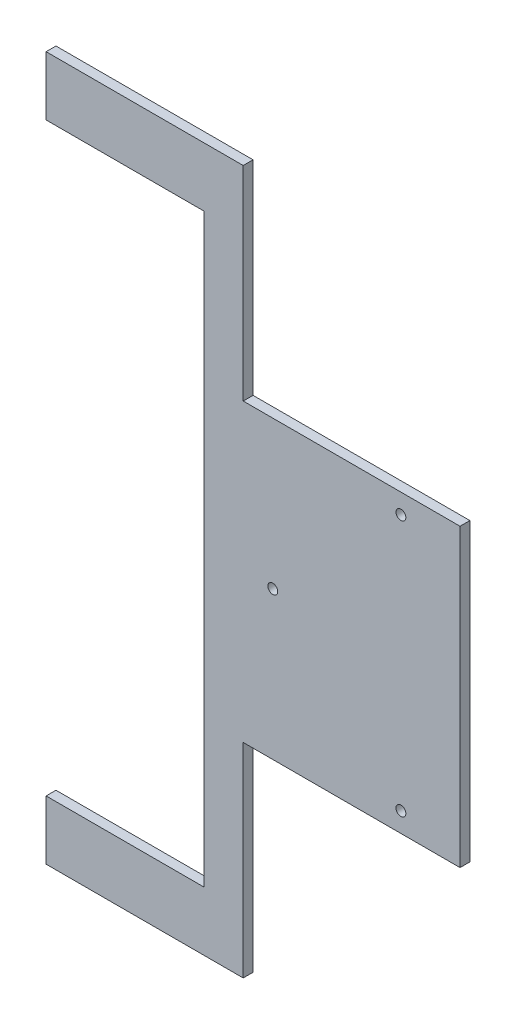
ISO-10303-21;
HEADER;
FILE_DESCRIPTION(('STEP AP214'),'2;1');
FILE_NAME('part.step','',(''),(''),'','','');
FILE_SCHEMA(('AUTOMOTIVE_DESIGN { 1 0 10303 214 1 1 1 1 }'));
ENDSEC;
DATA;
#1=APPLICATION_CONTEXT('core data for automotive mechanical design processes');
#2=APPLICATION_PROTOCOL_DEFINITION('international standard','automotive_design',2000,#1);
#3=PRODUCT_CONTEXT('',#1,'mechanical');
#4=PRODUCT('Part','Part','',(#3));
#5=PRODUCT_RELATED_PRODUCT_CATEGORY('part','',(#4));
#6=PRODUCT_DEFINITION_FORMATION('','',#4);
#7=PRODUCT_DEFINITION_CONTEXT('part definition',#1,'design');
#8=PRODUCT_DEFINITION('design','',#6,#7);
#9=PRODUCT_DEFINITION_SHAPE('','',#8);
#10=(LENGTH_UNIT() NAMED_UNIT(*) SI_UNIT(.MILLI.,.METRE.));
#11=(NAMED_UNIT(*) PLANE_ANGLE_UNIT() SI_UNIT($,.RADIAN.));
#12=(NAMED_UNIT(*) SI_UNIT($,.STERADIAN.) SOLID_ANGLE_UNIT());
#13=UNCERTAINTY_MEASURE_WITH_UNIT(LENGTH_MEASURE(1.E-05),#10,'distance_accuracy_value','');
#14=(GEOMETRIC_REPRESENTATION_CONTEXT(3) GLOBAL_UNCERTAINTY_ASSIGNED_CONTEXT((#13)) GLOBAL_UNIT_ASSIGNED_CONTEXT((#10,
#11,#12)) REPRESENTATION_CONTEXT('',''));
#15=CARTESIAN_POINT('',(0.,0.,0.));
#16=DIRECTION('',(0.,0.,1.));
#17=DIRECTION('',(1.,0.,0.));
#18=AXIS2_PLACEMENT_3D('',#15,#16,#17);
#19=CARTESIAN_POINT('',(0.,0.,5.));
#20=DIRECTION('',(0.,0.,1.));
#21=DIRECTION('',(1.,0.,0.));
#22=AXIS2_PLACEMENT_3D('',#19,#20,#21);
#23=PLANE('',#22);
#24=CARTESIAN_POINT('',(30.0006920415225,-47.4544735541276,5.));
#25=DIRECTION('',(0.,0.,1.));
#26=DIRECTION('',(1.,0.,0.));
#27=AXIS2_PLACEMENT_3D('',#24,#25,#26);
#28=CIRCLE('',#27,2.5);
#29=CARTESIAN_POINT('',(32.5006920415225,-47.4544735541276,5.));
#30=VERTEX_POINT('',#29);
#31=EDGE_CURVE('E290',#30,#30,#28,.T.);
#32=ORIENTED_EDGE('',*,*,#31,.F.);
#33=EDGE_LOOP('',(#32));
#34=FACE_BOUND('',#33,.T.);
#35=DIRECTION('',(0.,-1.,0.));
#36=VECTOR('',#35,1.);
#37=CARTESIAN_POINT('',(-149.999307958477,166.045526445872,5.));
#38=LINE('',#37,#36);
#39=CARTESIAN_POINT('',(-149.999307958477,196.045526445872,5.));
#40=VERTEX_POINT('',#39);
#41=CARTESIAN_POINT('',(-149.999307958477,166.045526445872,5.));
#42=VERTEX_POINT('',#41);
#43=EDGE_CURVE('E181',#40,#42,#38,.T.);
#44=ORIENTED_EDGE('',*,*,#43,.T.);
#45=DIRECTION('',(1.,0.,0.));
#46=VECTOR('',#45,1.);
#47=CARTESIAN_POINT('',(-69.9993079584775,166.045526445872,5.));
#48=LINE('',#47,#46);
#49=CARTESIAN_POINT('',(-69.9993079584775,166.045526445872,5.));
#50=VERTEX_POINT('',#49);
#51=EDGE_CURVE('E107',#42,#50,#48,.T.);
#52=ORIENTED_EDGE('',*,*,#51,.T.);
#53=DIRECTION('',(0.,-1.,0.));
#54=VECTOR('',#53,1.);
#55=CARTESIAN_POINT('',(-69.9993079584775,-130.954473554128,5.));
#56=LINE('',#55,#54);
#57=CARTESIAN_POINT('',(-69.9993079584775,-130.954473554128,5.));
#58=VERTEX_POINT('',#57);
#59=EDGE_CURVE('E208',#50,#58,#56,.T.);
#60=ORIENTED_EDGE('',*,*,#59,.T.);
#61=DIRECTION('',(-1.,0.,0.));
#62=VECTOR('',#61,1.);
#63=CARTESIAN_POINT('',(-69.9993079584775,-130.954473554128,5.));
#64=LINE('',#63,#62);
#65=CARTESIAN_POINT('',(-149.999307958477,-130.954473554128,5.));
#66=VERTEX_POINT('',#65);
#67=EDGE_CURVE('E227',#58,#66,#64,.T.);
#68=ORIENTED_EDGE('',*,*,#67,.T.);
#69=DIRECTION('',(0.,-1.,0.));
#70=VECTOR('',#69,1.);
#71=CARTESIAN_POINT('',(-149.999307958477,-160.954473554128,5.));
#72=LINE('',#71,#70);
#73=CARTESIAN_POINT('',(-149.999307958477,-160.954473554128,5.));
#74=VERTEX_POINT('',#73);
#75=EDGE_CURVE('E224',#66,#74,#72,.T.);
#76=ORIENTED_EDGE('',*,*,#75,.T.);
#77=DIRECTION('',(1.,0.,0.));
#78=VECTOR('',#77,1.);
#79=CARTESIAN_POINT('',(-49.9993079584775,-160.954473554128,5.));
#80=LINE('',#79,#78);
#81=CARTESIAN_POINT('',(-49.9993079584775,-160.954473554128,5.));
#82=VERTEX_POINT('',#81);
#83=EDGE_CURVE('E226',#74,#82,#80,.T.);
#84=ORIENTED_EDGE('',*,*,#83,.T.);
#85=DIRECTION('',(0.,1.,0.));
#86=VECTOR('',#85,1.);
#87=CARTESIAN_POINT('',(-49.9993079584775,-130.954473554128,5.));
#88=LINE('',#87,#86);
#89=CARTESIAN_POINT('',(-49.9993079584775,-57.4544735541275,5.));
#90=VERTEX_POINT('',#89);
#91=EDGE_CURVE('E229',#82,#90,#88,.T.);
#92=ORIENTED_EDGE('',*,*,#91,.T.);
#93=DIRECTION('',(1.,0.,0.));
#94=VECTOR('',#93,1.);
#95=CARTESIAN_POINT('',(60.0006920415225,-57.4544735541275,5.));
#96=LINE('',#95,#94);
#97=CARTESIAN_POINT('',(60.0006920415225,-57.4544735541275,5.));
#98=VERTEX_POINT('',#97);
#99=EDGE_CURVE('E235',#90,#98,#96,.T.);
#100=ORIENTED_EDGE('',*,*,#99,.T.);
#101=DIRECTION('',(0.,1.,0.));
#102=VECTOR('',#101,1.);
#103=CARTESIAN_POINT('',(60.0006920415225,92.5455264458725,5.));
#104=LINE('',#103,#102);
#105=CARTESIAN_POINT('',(60.0006920415225,92.5455264458725,5.));
#106=VERTEX_POINT('',#105);
#107=EDGE_CURVE('E138',#98,#106,#104,.T.);
#108=ORIENTED_EDGE('',*,*,#107,.T.);
#109=DIRECTION('',(-1.,0.,0.));
#110=VECTOR('',#109,1.);
#111=CARTESIAN_POINT('',(-49.9993079584775,92.5455264458725,5.));
#112=LINE('',#111,#110);
#113=CARTESIAN_POINT('',(-49.9993079584775,92.5455264458725,5.));
#114=VERTEX_POINT('',#113);
#115=EDGE_CURVE('E132',#106,#114,#112,.T.);
#116=ORIENTED_EDGE('',*,*,#115,.T.);
#117=DIRECTION('',(0.,1.,0.));
#118=VECTOR('',#117,1.);
#119=CARTESIAN_POINT('',(-49.9993079584775,166.045526445872,5.));
#120=LINE('',#119,#118);
#121=CARTESIAN_POINT('',(-49.9993079584775,196.045526445872,5.));
#122=VERTEX_POINT('',#121);
#123=EDGE_CURVE('E136',#114,#122,#120,.T.);
#124=ORIENTED_EDGE('',*,*,#123,.T.);
#125=DIRECTION('',(-1.,0.,0.));
#126=VECTOR('',#125,1.);
#127=CARTESIAN_POINT('',(-49.9993079584775,196.045526445872,5.));
#128=LINE('',#127,#126);
#129=EDGE_CURVE('E53',#122,#40,#128,.T.);
#130=ORIENTED_EDGE('',*,*,#129,.T.);
#131=EDGE_LOOP('',(#44,#52,#60,#68,#76,#84,#92,#100,#108,#116,#124,#130));
#132=FACE_BOUND('',#131,.T.);
#133=CARTESIAN_POINT('',(-34.9993079584775,17.5455264458724,5.));
#134=DIRECTION('',(0.,0.,1.));
#135=DIRECTION('',(1.,0.,0.));
#136=AXIS2_PLACEMENT_3D('',#133,#134,#135);
#137=CIRCLE('',#136,2.5);
#138=CARTESIAN_POINT('',(-32.4993079584775,17.5455264458724,5.));
#139=VERTEX_POINT('',#138);
#140=EDGE_CURVE('E161',#139,#139,#137,.T.);
#141=ORIENTED_EDGE('',*,*,#140,.F.);
#142=EDGE_LOOP('',(#141));
#143=FACE_BOUND('',#142,.T.);
#144=CARTESIAN_POINT('',(30.0006920415225,82.5455264458725,5.));
#145=DIRECTION('',(0.,0.,1.));
#146=DIRECTION('',(1.,0.,0.));
#147=AXIS2_PLACEMENT_3D('',#144,#145,#146);
#148=CIRCLE('',#147,2.5);
#149=CARTESIAN_POINT('',(32.5006920415225,82.5455264458725,5.));
#150=VERTEX_POINT('',#149);
#151=EDGE_CURVE('E281',#150,#150,#148,.T.);
#152=ORIENTED_EDGE('',*,*,#151,.F.);
#153=EDGE_LOOP('',(#152));
#154=FACE_BOUND('',#153,.T.);
#155=ADVANCED_FACE('F36',(#34,#132,#143,#154),#23,.T.);
#156=CARTESIAN_POINT('',(0.,0.,0.));
#157=DIRECTION('',(0.,0.,1.));
#158=DIRECTION('',(1.,0.,0.));
#159=AXIS2_PLACEMENT_3D('',#156,#157,#158);
#160=PLANE('',#159);
#161=DIRECTION('',(0.,-1.,0.));
#162=VECTOR('',#161,1.);
#163=CARTESIAN_POINT('',(-149.999307958477,166.045526445872,0.));
#164=LINE('',#163,#162);
#165=CARTESIAN_POINT('',(-149.999307958477,196.045526445872,0.));
#166=VERTEX_POINT('',#165);
#167=CARTESIAN_POINT('',(-149.999307958477,166.045526445872,0.));
#168=VERTEX_POINT('',#167);
#169=EDGE_CURVE('E157',#166,#168,#164,.T.);
#170=ORIENTED_EDGE('',*,*,#169,.F.);
#171=DIRECTION('',(-1.,0.,0.));
#172=VECTOR('',#171,1.);
#173=CARTESIAN_POINT('',(-49.9993079584775,196.045526445872,0.));
#174=LINE('',#173,#172);
#175=CARTESIAN_POINT('',(-49.9993079584775,196.045526445872,0.));
#176=VERTEX_POINT('',#175);
#177=EDGE_CURVE('E99',#176,#166,#174,.T.);
#178=ORIENTED_EDGE('',*,*,#177,.F.);
#179=DIRECTION('',(0.,1.,0.));
#180=VECTOR('',#179,1.);
#181=CARTESIAN_POINT('',(-49.9993079584775,166.045526445872,0.));
#182=LINE('',#181,#180);
#183=CARTESIAN_POINT('',(-49.9993079584775,92.5455264458725,0.));
#184=VERTEX_POINT('',#183);
#185=EDGE_CURVE('E93',#184,#176,#182,.T.);
#186=ORIENTED_EDGE('',*,*,#185,.F.);
#187=DIRECTION('',(-1.,0.,0.));
#188=VECTOR('',#187,1.);
#189=CARTESIAN_POINT('',(-49.9993079584775,92.5455264458725,0.));
#190=LINE('',#189,#188);
#191=CARTESIAN_POINT('',(60.0006920415225,92.5455264458725,0.));
#192=VERTEX_POINT('',#191);
#193=EDGE_CURVE('E147',#192,#184,#190,.T.);
#194=ORIENTED_EDGE('',*,*,#193,.F.);
#195=DIRECTION('',(0.,1.,0.));
#196=VECTOR('',#195,1.);
#197=CARTESIAN_POINT('',(60.0006920415225,92.5455264458725,0.));
#198=LINE('',#197,#196);
#199=CARTESIAN_POINT('',(60.0006920415225,-57.4544735541275,0.));
#200=VERTEX_POINT('',#199);
#201=EDGE_CURVE('E176',#200,#192,#198,.T.);
#202=ORIENTED_EDGE('',*,*,#201,.F.);
#203=DIRECTION('',(1.,0.,0.));
#204=VECTOR('',#203,1.);
#205=CARTESIAN_POINT('',(60.0006920415225,-57.4544735541275,0.));
#206=LINE('',#205,#204);
#207=CARTESIAN_POINT('',(-49.9993079584775,-57.4544735541275,0.));
#208=VERTEX_POINT('',#207);
#209=EDGE_CURVE('E174',#208,#200,#206,.T.);
#210=ORIENTED_EDGE('',*,*,#209,.F.);
#211=DIRECTION('',(0.,1.,0.));
#212=VECTOR('',#211,1.);
#213=CARTESIAN_POINT('',(-49.9993079584775,-130.954473554128,0.));
#214=LINE('',#213,#212);
#215=CARTESIAN_POINT('',(-49.9993079584775,-160.954473554128,0.));
#216=VERTEX_POINT('',#215);
#217=EDGE_CURVE('E172',#216,#208,#214,.T.);
#218=ORIENTED_EDGE('',*,*,#217,.F.);
#219=DIRECTION('',(1.,0.,0.));
#220=VECTOR('',#219,1.);
#221=CARTESIAN_POINT('',(-49.9993079584775,-160.954473554128,0.));
#222=LINE('',#221,#220);
#223=CARTESIAN_POINT('',(-149.999307958477,-160.954473554128,0.));
#224=VERTEX_POINT('',#223);
#225=EDGE_CURVE('E169',#224,#216,#222,.T.);
#226=ORIENTED_EDGE('',*,*,#225,.F.);
#227=DIRECTION('',(0.,-1.,0.));
#228=VECTOR('',#227,1.);
#229=CARTESIAN_POINT('',(-149.999307958477,-160.954473554128,0.));
#230=LINE('',#229,#228);
#231=CARTESIAN_POINT('',(-149.999307958477,-130.954473554128,0.));
#232=VERTEX_POINT('',#231);
#233=EDGE_CURVE('E167',#232,#224,#230,.T.);
#234=ORIENTED_EDGE('',*,*,#233,.F.);
#235=DIRECTION('',(-1.,0.,0.));
#236=VECTOR('',#235,1.);
#237=CARTESIAN_POINT('',(-69.9993079584775,-130.954473554128,0.));
#238=LINE('',#237,#236);
#239=CARTESIAN_POINT('',(-69.9993079584775,-130.954473554128,0.));
#240=VERTEX_POINT('',#239);
#241=EDGE_CURVE('E165',#240,#232,#238,.T.);
#242=ORIENTED_EDGE('',*,*,#241,.F.);
#243=DIRECTION('',(0.,-1.,0.));
#244=VECTOR('',#243,1.);
#245=CARTESIAN_POINT('',(-69.9993079584775,-130.954473554128,0.));
#246=LINE('',#245,#244);
#247=CARTESIAN_POINT('',(-69.9993079584775,166.045526445872,0.));
#248=VERTEX_POINT('',#247);
#249=EDGE_CURVE('E163',#248,#240,#246,.T.);
#250=ORIENTED_EDGE('',*,*,#249,.F.);
#251=DIRECTION('',(1.,0.,0.));
#252=VECTOR('',#251,1.);
#253=CARTESIAN_POINT('',(-69.9993079584775,166.045526445872,0.));
#254=LINE('',#253,#252);
#255=EDGE_CURVE('E160',#168,#248,#254,.T.);
#256=ORIENTED_EDGE('',*,*,#255,.F.);
#257=EDGE_LOOP('',(#170,#178,#186,#194,#202,#210,#218,#226,#234,#242,#250,#256));
#258=FACE_BOUND('',#257,.T.);
#259=CARTESIAN_POINT('',(-34.9993079584775,17.5455264458724,0.));
#260=DIRECTION('',(0.,0.,1.));
#261=DIRECTION('',(1.,0.,0.));
#262=AXIS2_PLACEMENT_3D('',#259,#260,#261);
#263=CIRCLE('',#262,2.5);
#264=CARTESIAN_POINT('',(-32.4993079584775,17.5455264458724,0.));
#265=VERTEX_POINT('',#264);
#266=EDGE_CURVE('E293',#265,#265,#263,.T.);
#267=ORIENTED_EDGE('',*,*,#266,.T.);
#268=EDGE_LOOP('',(#267));
#269=FACE_BOUND('',#268,.T.);
#270=CARTESIAN_POINT('',(30.0006920415225,-47.4544735541276,0.));
#271=DIRECTION('',(0.,0.,1.));
#272=DIRECTION('',(1.,0.,0.));
#273=AXIS2_PLACEMENT_3D('',#270,#271,#272);
#274=CIRCLE('',#273,2.5);
#275=CARTESIAN_POINT('',(32.5006920415225,-47.4544735541276,0.));
#276=VERTEX_POINT('',#275);
#277=EDGE_CURVE('E287',#276,#276,#274,.T.);
#278=ORIENTED_EDGE('',*,*,#277,.T.);
#279=EDGE_LOOP('',(#278));
#280=FACE_BOUND('',#279,.T.);
#281=CARTESIAN_POINT('',(30.0006920415225,82.5455264458725,0.));
#282=DIRECTION('',(0.,0.,1.));
#283=DIRECTION('',(1.,0.,0.));
#284=AXIS2_PLACEMENT_3D('',#281,#282,#283);
#285=CIRCLE('',#284,2.5);
#286=CARTESIAN_POINT('',(32.5006920415225,82.5455264458725,0.));
#287=VERTEX_POINT('',#286);
#288=EDGE_CURVE('E284',#287,#287,#285,.T.);
#289=ORIENTED_EDGE('',*,*,#288,.T.);
#290=EDGE_LOOP('',(#289));
#291=FACE_BOUND('',#290,.T.);
#292=ADVANCED_FACE('F212',(#258,#269,#280,#291),#160,.F.);
#293=CARTESIAN_POINT('',(-149.999307958477,166.045526445872,5.));
#294=DIRECTION('',(1.,0.,0.));
#295=DIRECTION('',(0.,0.,-1.));
#296=AXIS2_PLACEMENT_3D('',#293,#294,#295);
#297=PLANE('',#296);
#298=ORIENTED_EDGE('',*,*,#169,.T.);
#299=DIRECTION('',(0.,0.,-1.));
#300=VECTOR('',#299,1.);
#301=CARTESIAN_POINT('',(-149.999307958477,166.045526445872,5.));
#302=LINE('',#301,#300);
#303=EDGE_CURVE('E11',#42,#168,#302,.T.);
#304=ORIENTED_EDGE('',*,*,#303,.F.);
#305=ORIENTED_EDGE('',*,*,#43,.F.);
#306=DIRECTION('',(0.,0.,-1.));
#307=VECTOR('',#306,1.);
#308=CARTESIAN_POINT('',(-149.999307958477,196.045526445872,5.));
#309=LINE('',#308,#307);
#310=EDGE_CURVE('E153',#40,#166,#309,.T.);
#311=ORIENTED_EDGE('',*,*,#310,.T.);
#312=EDGE_LOOP('',(#298,#304,#305,#311));
#313=FACE_BOUND('',#312,.T.);
#314=ADVANCED_FACE('F38',(#313),#297,.F.);
#315=CARTESIAN_POINT('',(-69.9993079584775,166.045526445872,5.));
#316=DIRECTION('',(0.,1.,0.));
#317=DIRECTION('',(0.,0.,1.));
#318=AXIS2_PLACEMENT_3D('',#315,#316,#317);
#319=PLANE('',#318);
#320=ORIENTED_EDGE('',*,*,#255,.T.);
#321=DIRECTION('',(0.,0.,-1.));
#322=VECTOR('',#321,1.);
#323=CARTESIAN_POINT('',(-69.9993079584775,166.045526445872,5.));
#324=LINE('',#323,#322);
#325=EDGE_CURVE('E45',#50,#248,#324,.T.);
#326=ORIENTED_EDGE('',*,*,#325,.F.);
#327=ORIENTED_EDGE('',*,*,#51,.F.);
#328=ORIENTED_EDGE('',*,*,#303,.T.);
#329=EDGE_LOOP('',(#320,#326,#327,#328));
#330=FACE_BOUND('',#329,.T.);
#331=ADVANCED_FACE('F397',(#330),#319,.F.);
#332=CARTESIAN_POINT('',(-69.9993079584775,-130.954473554128,5.));
#333=DIRECTION('',(1.,0.,0.));
#334=DIRECTION('',(0.,0.,-1.));
#335=AXIS2_PLACEMENT_3D('',#332,#333,#334);
#336=PLANE('',#335);
#337=ORIENTED_EDGE('',*,*,#249,.T.);
#338=DIRECTION('',(0.,0.,-1.));
#339=VECTOR('',#338,1.);
#340=CARTESIAN_POINT('',(-69.9993079584775,-130.954473554128,5.));
#341=LINE('',#340,#339);
#342=EDGE_CURVE('E200',#58,#240,#341,.T.);
#343=ORIENTED_EDGE('',*,*,#342,.F.);
#344=ORIENTED_EDGE('',*,*,#59,.F.);
#345=ORIENTED_EDGE('',*,*,#325,.T.);
#346=EDGE_LOOP('',(#337,#343,#344,#345));
#347=FACE_BOUND('',#346,.T.);
#348=ADVANCED_FACE('F206',(#347),#336,.F.);
#349=CARTESIAN_POINT('',(-69.9993079584775,-130.954473554128,5.));
#350=DIRECTION('',(0.,-1.,0.));
#351=DIRECTION('',(0.,0.,-1.));
#352=AXIS2_PLACEMENT_3D('',#349,#350,#351);
#353=PLANE('',#352);
#354=ORIENTED_EDGE('',*,*,#241,.T.);
#355=DIRECTION('',(0.,0.,-1.));
#356=VECTOR('',#355,1.);
#357=CARTESIAN_POINT('',(-149.999307958477,-130.954473554128,5.));
#358=LINE('',#357,#356);
#359=EDGE_CURVE('E197',#66,#232,#358,.T.);
#360=ORIENTED_EDGE('',*,*,#359,.F.);
#361=ORIENTED_EDGE('',*,*,#67,.F.);
#362=ORIENTED_EDGE('',*,*,#342,.T.);
#363=EDGE_LOOP('',(#354,#360,#361,#362));
#364=FACE_BOUND('',#363,.T.);
#365=ADVANCED_FACE('F218',(#364),#353,.F.);
#366=CARTESIAN_POINT('',(-149.999307958477,-160.954473554128,5.));
#367=DIRECTION('',(1.,0.,0.));
#368=DIRECTION('',(0.,0.,-1.));
#369=AXIS2_PLACEMENT_3D('',#366,#367,#368);
#370=PLANE('',#369);
#371=ORIENTED_EDGE('',*,*,#233,.T.);
#372=DIRECTION('',(0.,0.,-1.));
#373=VECTOR('',#372,1.);
#374=CARTESIAN_POINT('',(-149.999307958477,-160.954473554128,5.));
#375=LINE('',#374,#373);
#376=EDGE_CURVE('E194',#74,#224,#375,.T.);
#377=ORIENTED_EDGE('',*,*,#376,.F.);
#378=ORIENTED_EDGE('',*,*,#75,.F.);
#379=ORIENTED_EDGE('',*,*,#359,.T.);
#380=EDGE_LOOP('',(#371,#377,#378,#379));
#381=FACE_BOUND('',#380,.T.);
#382=ADVANCED_FACE('F222',(#381),#370,.F.);
#383=CARTESIAN_POINT('',(-49.9993079584775,-160.954473554128,5.));
#384=DIRECTION('',(0.,1.,0.));
#385=DIRECTION('',(0.,0.,1.));
#386=AXIS2_PLACEMENT_3D('',#383,#384,#385);
#387=PLANE('',#386);
#388=ORIENTED_EDGE('',*,*,#225,.T.);
#389=DIRECTION('',(0.,0.,-1.));
#390=VECTOR('',#389,1.);
#391=CARTESIAN_POINT('',(-49.9993079584775,-160.954473554128,5.));
#392=LINE('',#391,#390);
#393=EDGE_CURVE('E191',#82,#216,#392,.T.);
#394=ORIENTED_EDGE('',*,*,#393,.F.);
#395=ORIENTED_EDGE('',*,*,#83,.F.);
#396=ORIENTED_EDGE('',*,*,#376,.T.);
#397=EDGE_LOOP('',(#388,#394,#395,#396));
#398=FACE_BOUND('',#397,.T.);
#399=ADVANCED_FACE('F361',(#398),#387,.F.);
#400=CARTESIAN_POINT('',(-49.9993079584775,-130.954473554128,5.));
#401=DIRECTION('',(-1.,0.,0.));
#402=DIRECTION('',(0.,-1.,0.));
#403=AXIS2_PLACEMENT_3D('',#400,#401,#402);
#404=PLANE('',#403);
#405=ORIENTED_EDGE('',*,*,#217,.T.);
#406=DIRECTION('',(0.,0.,-1.));
#407=VECTOR('',#406,1.);
#408=CARTESIAN_POINT('',(-49.9993079584775,-57.4544735541275,5.));
#409=LINE('',#408,#407);
#410=EDGE_CURVE('E188',#90,#208,#409,.T.);
#411=ORIENTED_EDGE('',*,*,#410,.F.);
#412=ORIENTED_EDGE('',*,*,#91,.F.);
#413=ORIENTED_EDGE('',*,*,#393,.T.);
#414=EDGE_LOOP('',(#405,#411,#412,#413));
#415=FACE_BOUND('',#414,.T.);
#416=ADVANCED_FACE('F352',(#415),#404,.F.);
#417=CARTESIAN_POINT('',(60.0006920415225,-57.4544735541275,5.));
#418=DIRECTION('',(0.,1.,0.));
#419=DIRECTION('',(0.,0.,1.));
#420=AXIS2_PLACEMENT_3D('',#417,#418,#419);
#421=PLANE('',#420);
#422=ORIENTED_EDGE('',*,*,#209,.T.);
#423=DIRECTION('',(0.,0.,-1.));
#424=VECTOR('',#423,1.);
#425=CARTESIAN_POINT('',(60.0006920415225,-57.4544735541275,5.));
#426=LINE('',#425,#424);
#427=EDGE_CURVE('E185',#98,#200,#426,.T.);
#428=ORIENTED_EDGE('',*,*,#427,.F.);
#429=ORIENTED_EDGE('',*,*,#99,.F.);
#430=ORIENTED_EDGE('',*,*,#410,.T.);
#431=EDGE_LOOP('',(#422,#428,#429,#430));
#432=FACE_BOUND('',#431,.T.);
#433=ADVANCED_FACE('F241',(#432),#421,.F.);
#434=CARTESIAN_POINT('',(60.0006920415225,92.5455264458725,5.));
#435=DIRECTION('',(-1.,0.,0.));
#436=DIRECTION('',(0.,0.,1.));
#437=AXIS2_PLACEMENT_3D('',#434,#435,#436);
#438=PLANE('',#437);
#439=ORIENTED_EDGE('',*,*,#201,.T.);
#440=DIRECTION('',(0.,0.,-1.));
#441=VECTOR('',#440,1.);
#442=CARTESIAN_POINT('',(60.0006920415225,92.5455264458725,5.));
#443=LINE('',#442,#441);
#444=EDGE_CURVE('E148',#106,#192,#443,.T.);
#445=ORIENTED_EDGE('',*,*,#444,.F.);
#446=ORIENTED_EDGE('',*,*,#107,.F.);
#447=ORIENTED_EDGE('',*,*,#427,.T.);
#448=EDGE_LOOP('',(#439,#445,#446,#447));
#449=FACE_BOUND('',#448,.T.);
#450=ADVANCED_FACE('F245',(#449),#438,.F.);
#451=CARTESIAN_POINT('',(-49.9993079584775,92.5455264458725,5.));
#452=DIRECTION('',(0.,-1.,0.));
#453=DIRECTION('',(0.,0.,-1.));
#454=AXIS2_PLACEMENT_3D('',#451,#452,#453);
#455=PLANE('',#454);
#456=ORIENTED_EDGE('',*,*,#193,.T.);
#457=DIRECTION('',(0.,0.,-1.));
#458=VECTOR('',#457,1.);
#459=CARTESIAN_POINT('',(-49.9993079584775,92.5455264458725,5.));
#460=LINE('',#459,#458);
#461=EDGE_CURVE('E144',#114,#184,#460,.T.);
#462=ORIENTED_EDGE('',*,*,#461,.F.);
#463=ORIENTED_EDGE('',*,*,#115,.F.);
#464=ORIENTED_EDGE('',*,*,#444,.T.);
#465=EDGE_LOOP('',(#456,#462,#463,#464));
#466=FACE_BOUND('',#465,.T.);
#467=ADVANCED_FACE('F145',(#466),#455,.F.);
#468=CARTESIAN_POINT('',(-49.9993079584775,166.045526445872,5.));
#469=DIRECTION('',(-1.,0.,0.));
#470=DIRECTION('',(0.,0.,1.));
#471=AXIS2_PLACEMENT_3D('',#468,#469,#470);
#472=PLANE('',#471);
#473=ORIENTED_EDGE('',*,*,#185,.T.);
#474=DIRECTION('',(0.,0.,-1.));
#475=VECTOR('',#474,1.);
#476=CARTESIAN_POINT('',(-49.9993079584775,196.045526445872,5.));
#477=LINE('',#476,#475);
#478=EDGE_CURVE('E149',#122,#176,#477,.T.);
#479=ORIENTED_EDGE('',*,*,#478,.F.);
#480=ORIENTED_EDGE('',*,*,#123,.F.);
#481=ORIENTED_EDGE('',*,*,#461,.T.);
#482=EDGE_LOOP('',(#473,#479,#480,#481));
#483=FACE_BOUND('',#482,.T.);
#484=ADVANCED_FACE('F151',(#483),#472,.F.);
#485=CARTESIAN_POINT('',(-49.9993079584775,196.045526445872,5.));
#486=DIRECTION('',(0.,-1.,0.));
#487=DIRECTION('',(0.,0.,-1.));
#488=AXIS2_PLACEMENT_3D('',#485,#486,#487);
#489=PLANE('',#488);
#490=ORIENTED_EDGE('',*,*,#177,.T.);
#491=ORIENTED_EDGE('',*,*,#310,.F.);
#492=ORIENTED_EDGE('',*,*,#129,.F.);
#493=ORIENTED_EDGE('',*,*,#478,.T.);
#494=EDGE_LOOP('',(#490,#491,#492,#493));
#495=FACE_BOUND('',#494,.T.);
#496=ADVANCED_FACE('F249',(#495),#489,.F.);
#497=CARTESIAN_POINT('',(-34.9993079584775,17.5455264458724,5.));
#498=DIRECTION('',(0.,0.,-1.));
#499=DIRECTION('',(-1.,0.,0.));
#500=AXIS2_PLACEMENT_3D('',#497,#498,#499);
#501=CYLINDRICAL_SURFACE('',#500,2.5);
#502=ORIENTED_EDGE('',*,*,#140,.T.);
#503=EDGE_LOOP('',(#502));
#504=FACE_BOUND('',#503,.T.);
#505=ORIENTED_EDGE('',*,*,#266,.F.);
#506=EDGE_LOOP('',(#505));
#507=FACE_BOUND('',#506,.T.);
#508=ADVANCED_FACE('F251',(#504,#507),#501,.F.);
#509=CARTESIAN_POINT('',(30.0006920415225,-47.4544735541276,5.));
#510=DIRECTION('',(0.,0.,-1.));
#511=DIRECTION('',(-1.,0.,0.));
#512=AXIS2_PLACEMENT_3D('',#509,#510,#511);
#513=CYLINDRICAL_SURFACE('',#512,2.5);
#514=ORIENTED_EDGE('',*,*,#31,.T.);
#515=EDGE_LOOP('',(#514));
#516=FACE_BOUND('',#515,.T.);
#517=ORIENTED_EDGE('',*,*,#277,.F.);
#518=EDGE_LOOP('',(#517));
#519=FACE_BOUND('',#518,.T.);
#520=ADVANCED_FACE('F257',(#516,#519),#513,.F.);
#521=CARTESIAN_POINT('',(30.0006920415225,82.5455264458725,5.));
#522=DIRECTION('',(0.,0.,-1.));
#523=DIRECTION('',(-1.,0.,0.));
#524=AXIS2_PLACEMENT_3D('',#521,#522,#523);
#525=CYLINDRICAL_SURFACE('',#524,2.5);
#526=ORIENTED_EDGE('',*,*,#151,.T.);
#527=EDGE_LOOP('',(#526));
#528=FACE_BOUND('',#527,.T.);
#529=ORIENTED_EDGE('',*,*,#288,.F.);
#530=EDGE_LOOP('',(#529));
#531=FACE_BOUND('',#530,.T.);
#532=ADVANCED_FACE('F272',(#528,#531),#525,.F.);
#533=CLOSED_SHELL('',(#155,#292,#314,#331,#348,#365,#382,#399,#416,#433,#450,#467,#484,#496,
#508,#520,#532));
#534=MANIFOLD_SOLID_BREP('B2',#533);
#535=ADVANCED_BREP_SHAPE_REPRESENTATION('',(#18,#534),#14);
#536=SHAPE_DEFINITION_REPRESENTATION(#9,#535);
ENDSEC;
END-ISO-10303-21;
